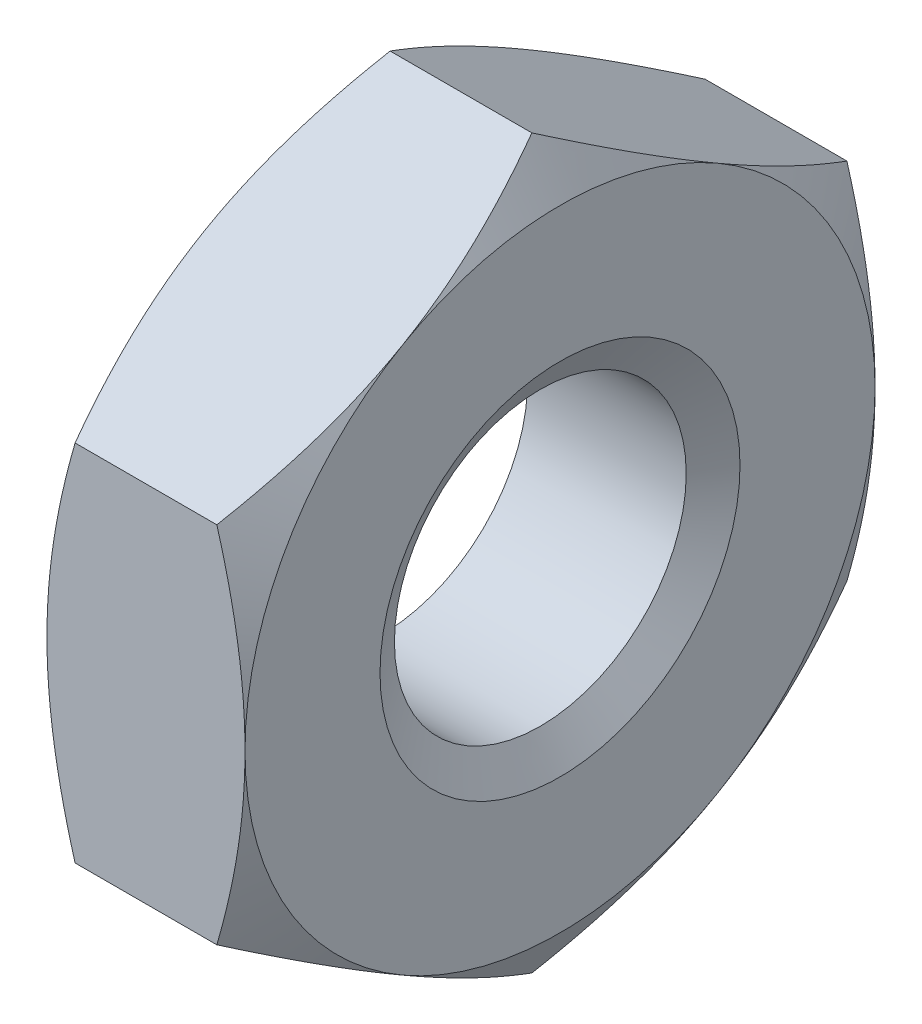
ISO-10303-21;
HEADER;
FILE_DESCRIPTION(('STEP AP214'),'2;1');
FILE_NAME('part.step','',(''),(''),'','','');
FILE_SCHEMA(('AUTOMOTIVE_DESIGN { 1 0 10303 214 1 1 1 1 }'));
ENDSEC;
DATA;
#1=APPLICATION_CONTEXT('core data for automotive mechanical design processes');
#2=APPLICATION_PROTOCOL_DEFINITION('international standard','automotive_design',2000,#1);
#3=PRODUCT_CONTEXT('',#1,'mechanical');
#4=PRODUCT('Part','Part','',(#3));
#5=PRODUCT_RELATED_PRODUCT_CATEGORY('part','',(#4));
#6=PRODUCT_DEFINITION_FORMATION('','',#4);
#7=PRODUCT_DEFINITION_CONTEXT('part definition',#1,'design');
#8=PRODUCT_DEFINITION('design','',#6,#7);
#9=PRODUCT_DEFINITION_SHAPE('','',#8);
#10=(LENGTH_UNIT() NAMED_UNIT(*) SI_UNIT(.MILLI.,.METRE.));
#11=(NAMED_UNIT(*) PLANE_ANGLE_UNIT() SI_UNIT($,.RADIAN.));
#12=(NAMED_UNIT(*) SI_UNIT($,.STERADIAN.) SOLID_ANGLE_UNIT());
#13=UNCERTAINTY_MEASURE_WITH_UNIT(LENGTH_MEASURE(1.E-05),#10,'distance_accuracy_value','');
#14=(GEOMETRIC_REPRESENTATION_CONTEXT(3) GLOBAL_UNCERTAINTY_ASSIGNED_CONTEXT((#13)) GLOBAL_UNIT_ASSIGNED_CONTEXT((#10,
#11,#12)) REPRESENTATION_CONTEXT('',''));
#15=CARTESIAN_POINT('',(0.,0.,0.));
#16=DIRECTION('',(0.,0.,1.));
#17=DIRECTION('',(1.,0.,0.));
#18=AXIS2_PLACEMENT_3D('',#15,#16,#17);
#19=CARTESIAN_POINT('',(0.,-2.02072594216368,-3.5));
#20=DIRECTION('',(0.,-0.866025403784439,-0.5));
#21=DIRECTION('',(0.,0.5,-0.866025403784439));
#22=AXIS2_PLACEMENT_3D('',#19,#20,#21);
#23=PLANE('',#22);
#24=CARTESIAN_POINT('',(0.,-3.03108891324553,-1.75));
#25=CARTESIAN_POINT('',(0.,-2.56217782649107,-2.56217782649107));
#26=CARTESIAN_POINT('',(0.312607391169643,-2.02072594216369,-3.5));
#27=(BOUNDED_CURVE() B_SPLINE_CURVE(2,(#24,#25,#26),.UNSPECIFIED.,.F.,
.F.) B_SPLINE_CURVE_WITH_KNOTS((3,3),(0.204998401571335,0.409996803142671),
.UNSPECIFIED.) CURVE() GEOMETRIC_REPRESENTATION_ITEM() RATIONAL_B_SPLINE_CURVE((1.,
1.03795484930204,1.)) REPRESENTATION_ITEM(''));
#28=CARTESIAN_POINT('',(0.,-3.03108891324553,-1.75));
#29=VERTEX_POINT('',#28);
#30=CARTESIAN_POINT('',(0.312607391169643,-2.02072594216368,-3.5));
#31=VERTEX_POINT('',#30);
#32=EDGE_CURVE('E474',#29,#31,#27,.T.);
#33=ORIENTED_EDGE('',*,*,#32,.T.);
#34=DIRECTION('',(1.,0.,0.));
#35=VECTOR('',#34,1.);
#36=CARTESIAN_POINT('',(0.,-2.02072594216368,-3.5));
#37=LINE('',#36,#35);
#38=CARTESIAN_POINT('',(1.88739260883036,-2.02072594216368,-3.5));
#39=VERTEX_POINT('',#38);
#40=EDGE_CURVE('E11',#31,#39,#37,.T.);
#41=ORIENTED_EDGE('',*,*,#40,.T.);
#42=CARTESIAN_POINT('',(1.88739260883036,-2.02072594216369,-3.5));
#43=CARTESIAN_POINT('',(2.2,-2.56217782649107,-2.56217782649107));
#44=CARTESIAN_POINT('',(2.2,-3.03108891324553,-1.75));
#45=(BOUNDED_CURVE() B_SPLINE_CURVE(2,(#42,#43,#44),.UNSPECIFIED.,.F.,
.F.) B_SPLINE_CURVE_WITH_KNOTS((3,3),(0.,0.204998401571336),
.UNSPECIFIED.) CURVE() GEOMETRIC_REPRESENTATION_ITEM() RATIONAL_B_SPLINE_CURVE((1.,
1.03795484930204,1.)) REPRESENTATION_ITEM(''));
#46=CARTESIAN_POINT('',(2.2,-3.03108891324553,-1.75));
#47=VERTEX_POINT('',#46);
#48=EDGE_CURVE('E203',#39,#47,#45,.T.);
#49=ORIENTED_EDGE('',*,*,#48,.T.);
#50=CARTESIAN_POINT('',(2.2,-3.03108891324553,-1.75));
#51=CARTESIAN_POINT('',(2.2,-3.5,-0.937822173508929));
#52=CARTESIAN_POINT('',(1.88739260883036,-4.04145188432738,0.));
#53=(BOUNDED_CURVE() B_SPLINE_CURVE(2,(#50,#51,#52),.UNSPECIFIED.,.F.,
.F.) B_SPLINE_CURVE_WITH_KNOTS((3,3),(0.204998401571336,0.409996803142671),
.UNSPECIFIED.) CURVE() GEOMETRIC_REPRESENTATION_ITEM() RATIONAL_B_SPLINE_CURVE((1.,
1.03795484930205,1.)) REPRESENTATION_ITEM(''));
#54=CARTESIAN_POINT('',(1.88739260883036,-4.04145188432738,0.));
#55=VERTEX_POINT('',#54);
#56=EDGE_CURVE('E352',#47,#55,#53,.T.);
#57=ORIENTED_EDGE('',*,*,#56,.T.);
#58=DIRECTION('',(1.,0.,0.));
#59=VECTOR('',#58,1.);
#60=CARTESIAN_POINT('',(0.,-4.04145188432738,0.));
#61=LINE('',#60,#59);
#62=CARTESIAN_POINT('',(0.312607391169643,-4.04145188432738,0.));
#63=VERTEX_POINT('',#62);
#64=EDGE_CURVE('E284',#63,#55,#61,.T.);
#65=ORIENTED_EDGE('',*,*,#64,.F.);
#66=CARTESIAN_POINT('',(0.312607391169643,-4.04145188432738,0.));
#67=CARTESIAN_POINT('',(0.,-3.5,-0.937822173508931));
#68=CARTESIAN_POINT('',(0.,-3.03108891324553,-1.75));
#69=(BOUNDED_CURVE() B_SPLINE_CURVE(2,(#66,#67,#68),.UNSPECIFIED.,.F.,
.F.) B_SPLINE_CURVE_WITH_KNOTS((3,3),(0.,0.204998401571335),
.UNSPECIFIED.) CURVE() GEOMETRIC_REPRESENTATION_ITEM() RATIONAL_B_SPLINE_CURVE((1.,
1.03795484930204,1.)) REPRESENTATION_ITEM(''));
#70=EDGE_CURVE('E213',#63,#29,#69,.T.);
#71=ORIENTED_EDGE('',*,*,#70,.T.);
#72=EDGE_LOOP('',(#33,#41,#49,#57,#65,#71));
#73=FACE_BOUND('',#72,.T.);
#74=ADVANCED_FACE('F17',(#73),#23,.T.);
#75=CARTESIAN_POINT('',(0.,2.0207259421637,-3.5));
#76=DIRECTION('',(0.,0.,-1.));
#77=DIRECTION('',(-1.,0.,0.));
#78=AXIS2_PLACEMENT_3D('',#75,#76,#77);
#79=PLANE('',#78);
#80=CARTESIAN_POINT('',(0.,0.,-3.5));
#81=CARTESIAN_POINT('',(0.,0.937822173508934,-3.5));
#82=CARTESIAN_POINT('',(0.312607391169643,2.02072594216369,-3.5));
#83=(BOUNDED_CURVE() B_SPLINE_CURVE(2,(#80,#81,#82),.UNSPECIFIED.,.F.,
.F.) B_SPLINE_CURVE_WITH_KNOTS((3,3),(0.204998401571334,0.409996803142669),
.UNSPECIFIED.) CURVE() GEOMETRIC_REPRESENTATION_ITEM() RATIONAL_B_SPLINE_CURVE((1.,
1.03795484930204,1.)) REPRESENTATION_ITEM(''));
#84=CARTESIAN_POINT('',(0.,0.,-3.5));
#85=VERTEX_POINT('',#84);
#86=CARTESIAN_POINT('',(0.312607391169643,2.0207259421637,-3.5));
#87=VERTEX_POINT('',#86);
#88=EDGE_CURVE('E179',#85,#87,#83,.T.);
#89=ORIENTED_EDGE('',*,*,#88,.T.);
#90=DIRECTION('',(1.,0.,0.));
#91=VECTOR('',#90,1.);
#92=CARTESIAN_POINT('',(0.,2.0207259421637,-3.5));
#93=LINE('',#92,#91);
#94=CARTESIAN_POINT('',(1.88739260883036,2.0207259421637,-3.5));
#95=VERTEX_POINT('',#94);
#96=EDGE_CURVE('E27',#87,#95,#93,.T.);
#97=ORIENTED_EDGE('',*,*,#96,.T.);
#98=CARTESIAN_POINT('',(1.88739260883036,2.02072594216369,-3.5));
#99=CARTESIAN_POINT('',(2.2,0.937822173508933,-3.5));
#100=CARTESIAN_POINT('',(2.2,0.,-3.5));
#101=(BOUNDED_CURVE() B_SPLINE_CURVE(2,(#98,#99,#100),.UNSPECIFIED.,.F.,
.F.) B_SPLINE_CURVE_WITH_KNOTS((3,3),(0.,0.204998401571335),
.UNSPECIFIED.) CURVE() GEOMETRIC_REPRESENTATION_ITEM() RATIONAL_B_SPLINE_CURVE((1.,
1.03795484930204,1.)) REPRESENTATION_ITEM(''));
#102=CARTESIAN_POINT('',(2.2,0.,-3.5));
#103=VERTEX_POINT('',#102);
#104=EDGE_CURVE('E257',#95,#103,#101,.T.);
#105=ORIENTED_EDGE('',*,*,#104,.T.);
#106=CARTESIAN_POINT('',(2.2,0.,-3.5));
#107=CARTESIAN_POINT('',(2.2,-0.93782217350892,-3.50000000000001));
#108=CARTESIAN_POINT('',(1.88739260883036,-2.02072594216368,-3.5));
#109=(BOUNDED_CURVE() B_SPLINE_CURVE(2,(#106,#107,#108),.UNSPECIFIED.,.F.,
.F.) B_SPLINE_CURVE_WITH_KNOTS((3,3),(0.204998401571335,0.409996803142669),
.UNSPECIFIED.) CURVE() GEOMETRIC_REPRESENTATION_ITEM() RATIONAL_B_SPLINE_CURVE((1.,
1.03795484930204,1.)) REPRESENTATION_ITEM(''));
#110=EDGE_CURVE('E247',#103,#39,#109,.T.);
#111=ORIENTED_EDGE('',*,*,#110,.T.);
#112=ORIENTED_EDGE('',*,*,#40,.F.);
#113=CARTESIAN_POINT('',(0.312607391169643,-2.02072594216368,-3.5));
#114=CARTESIAN_POINT('',(0.,-0.937822173508922,-3.50000000000001));
#115=CARTESIAN_POINT('',(0.,0.,-3.5));
#116=(BOUNDED_CURVE() B_SPLINE_CURVE(2,(#113,#114,#115),.UNSPECIFIED.,.F.,
.F.) B_SPLINE_CURVE_WITH_KNOTS((3,3),(0.,0.204998401571334),
.UNSPECIFIED.) CURVE() GEOMETRIC_REPRESENTATION_ITEM() RATIONAL_B_SPLINE_CURVE((1.,
1.03795484930204,1.)) REPRESENTATION_ITEM(''));
#117=EDGE_CURVE('E337',#31,#85,#116,.T.);
#118=ORIENTED_EDGE('',*,*,#117,.T.);
#119=EDGE_LOOP('',(#89,#97,#105,#111,#112,#118));
#120=FACE_BOUND('',#119,.T.);
#121=ADVANCED_FACE('F511',(#120),#79,.T.);
#122=CARTESIAN_POINT('',(0.,4.04145188432738,0.));
#123=DIRECTION('',(0.,0.866025403784439,-0.5));
#124=DIRECTION('',(-1.,0.,0.));
#125=AXIS2_PLACEMENT_3D('',#122,#123,#124);
#126=PLANE('',#125);
#127=CARTESIAN_POINT('',(0.,3.03108891324554,-1.75));
#128=CARTESIAN_POINT('',(0.,3.5,-0.937822173508925));
#129=CARTESIAN_POINT('',(0.312607391169643,4.04145188432738,0.));
#130=(BOUNDED_CURVE() B_SPLINE_CURVE(2,(#127,#128,#129),.UNSPECIFIED.,.F.,
.F.) B_SPLINE_CURVE_WITH_KNOTS((3,3),(0.204998401571335,0.40999680314267),
.UNSPECIFIED.) CURVE() GEOMETRIC_REPRESENTATION_ITEM() RATIONAL_B_SPLINE_CURVE((1.,
1.03795484930204,1.)) REPRESENTATION_ITEM(''));
#131=CARTESIAN_POINT('',(0.,3.03108891324554,-1.75));
#132=VERTEX_POINT('',#131);
#133=CARTESIAN_POINT('',(0.312607391169643,4.04145188432738,0.));
#134=VERTEX_POINT('',#133);
#135=EDGE_CURVE('E173',#132,#134,#130,.T.);
#136=ORIENTED_EDGE('',*,*,#135,.T.);
#137=DIRECTION('',(1.,0.,0.));
#138=VECTOR('',#137,1.);
#139=CARTESIAN_POINT('',(0.,4.04145188432738,0.));
#140=LINE('',#139,#138);
#141=CARTESIAN_POINT('',(1.88739260883036,4.04145188432738,0.));
#142=VERTEX_POINT('',#141);
#143=EDGE_CURVE('E40',#134,#142,#140,.T.);
#144=ORIENTED_EDGE('',*,*,#143,.T.);
#145=CARTESIAN_POINT('',(1.88739260883036,4.04145188432738,0.));
#146=CARTESIAN_POINT('',(2.2,3.5,-0.937822173508927));
#147=CARTESIAN_POINT('',(2.2,3.03108891324554,-1.75));
#148=(BOUNDED_CURVE() B_SPLINE_CURVE(2,(#145,#146,#147),.UNSPECIFIED.,.F.,
.F.) B_SPLINE_CURVE_WITH_KNOTS((3,3),(0.,0.204998401571335),
.UNSPECIFIED.) CURVE() GEOMETRIC_REPRESENTATION_ITEM() RATIONAL_B_SPLINE_CURVE((1.,
1.03795484930204,1.)) REPRESENTATION_ITEM(''));
#149=CARTESIAN_POINT('',(2.2,3.03108891324554,-1.75));
#150=VERTEX_POINT('',#149);
#151=EDGE_CURVE('E161',#142,#150,#148,.T.);
#152=ORIENTED_EDGE('',*,*,#151,.T.);
#153=CARTESIAN_POINT('',(2.2,3.03108891324554,-1.75));
#154=CARTESIAN_POINT('',(2.2,2.56217782649108,-2.56217782649107));
#155=CARTESIAN_POINT('',(1.88739260883036,2.0207259421637,-3.5));
#156=(BOUNDED_CURVE() B_SPLINE_CURVE(2,(#153,#154,#155),.UNSPECIFIED.,.F.,
.F.) B_SPLINE_CURVE_WITH_KNOTS((3,3),(0.204998401571335,0.40999680314267),
.UNSPECIFIED.) CURVE() GEOMETRIC_REPRESENTATION_ITEM() RATIONAL_B_SPLINE_CURVE((1.,
1.03795484930207,1.)) REPRESENTATION_ITEM(''));
#157=EDGE_CURVE('E248',#150,#95,#156,.T.);
#158=ORIENTED_EDGE('',*,*,#157,.T.);
#159=ORIENTED_EDGE('',*,*,#96,.F.);
#160=CARTESIAN_POINT('',(0.312607391169643,2.0207259421637,-3.5));
#161=CARTESIAN_POINT('',(0.,2.56217782649108,-2.56217782649107));
#162=CARTESIAN_POINT('',(0.,3.03108891324554,-1.75));
#163=(BOUNDED_CURVE() B_SPLINE_CURVE(2,(#160,#161,#162),.UNSPECIFIED.,.F.,
.F.) B_SPLINE_CURVE_WITH_KNOTS((3,3),(0.,0.204998401571335),
.UNSPECIFIED.) CURVE() GEOMETRIC_REPRESENTATION_ITEM() RATIONAL_B_SPLINE_CURVE((1.,
1.03795484930205,1.)) REPRESENTATION_ITEM(''));
#164=EDGE_CURVE('E186',#87,#132,#163,.T.);
#165=ORIENTED_EDGE('',*,*,#164,.T.);
#166=EDGE_LOOP('',(#136,#144,#152,#158,#159,#165));
#167=FACE_BOUND('',#166,.T.);
#168=ADVANCED_FACE('F425',(#167),#126,.T.);
#169=CARTESIAN_POINT('',(0.,-4.04145188432738,0.));
#170=DIRECTION('',(0.,-0.866025403784439,0.5));
#171=DIRECTION('',(-1.,0.,0.));
#172=AXIS2_PLACEMENT_3D('',#169,#170,#171);
#173=PLANE('',#172);
#174=CARTESIAN_POINT('',(0.312607391169643,-2.02072594216369,3.5));
#175=CARTESIAN_POINT('',(0.,-2.56217782649107,2.56217782649107));
#176=CARTESIAN_POINT('',(0.,-3.03108891324554,1.75));
#177=(BOUNDED_CURVE() B_SPLINE_CURVE(2,(#174,#175,#176),.UNSPECIFIED.,.F.,
.F.) B_SPLINE_CURVE_WITH_KNOTS((3,3),(0.,0.204998401571335),
.UNSPECIFIED.) CURVE() GEOMETRIC_REPRESENTATION_ITEM() RATIONAL_B_SPLINE_CURVE((1.,
1.03795484930205,1.)) REPRESENTATION_ITEM(''));
#178=CARTESIAN_POINT('',(0.312607391169643,-2.02072594216369,3.5));
#179=VERTEX_POINT('',#178);
#180=CARTESIAN_POINT('',(0.,-3.03108891324554,1.75));
#181=VERTEX_POINT('',#180);
#182=EDGE_CURVE('E234',#179,#181,#177,.T.);
#183=ORIENTED_EDGE('',*,*,#182,.T.);
#184=CARTESIAN_POINT('',(0.,-3.03108891324554,1.75));
#185=CARTESIAN_POINT('',(0.,-3.5,0.937822173508929));
#186=CARTESIAN_POINT('',(0.312607391169643,-4.04145188432738,0.));
#187=(BOUNDED_CURVE() B_SPLINE_CURVE(2,(#184,#185,#186),.UNSPECIFIED.,.F.,
.F.) B_SPLINE_CURVE_WITH_KNOTS((3,3),(0.204998401571335,0.40999680314267),
.UNSPECIFIED.) CURVE() GEOMETRIC_REPRESENTATION_ITEM() RATIONAL_B_SPLINE_CURVE((1.,
1.03795484930205,1.)) REPRESENTATION_ITEM(''));
#188=EDGE_CURVE('E204',#181,#63,#187,.T.);
#189=ORIENTED_EDGE('',*,*,#188,.T.);
#190=ORIENTED_EDGE('',*,*,#64,.T.);
#191=CARTESIAN_POINT('',(1.88739260883036,-4.04145188432738,0.));
#192=CARTESIAN_POINT('',(2.2,-3.5,0.937822173508929));
#193=CARTESIAN_POINT('',(2.2,-3.03108891324554,1.75));
#194=(BOUNDED_CURVE() B_SPLINE_CURVE(2,(#191,#192,#193),.UNSPECIFIED.,.F.,
.F.) B_SPLINE_CURVE_WITH_KNOTS((3,3),(0.,0.204998401571335),
.UNSPECIFIED.) CURVE() GEOMETRIC_REPRESENTATION_ITEM() RATIONAL_B_SPLINE_CURVE((1.,
1.03795484930205,1.)) REPRESENTATION_ITEM(''));
#195=CARTESIAN_POINT('',(2.2,-3.03108891324554,1.75));
#196=VERTEX_POINT('',#195);
#197=EDGE_CURVE('E328',#55,#196,#194,.T.);
#198=ORIENTED_EDGE('',*,*,#197,.T.);
#199=CARTESIAN_POINT('',(2.2,-3.03108891324554,1.75));
#200=CARTESIAN_POINT('',(2.2,-2.56217782649107,2.56217782649107));
#201=CARTESIAN_POINT('',(1.88739260883036,-2.02072594216369,3.5));
#202=(BOUNDED_CURVE() B_SPLINE_CURVE(2,(#199,#200,#201),.UNSPECIFIED.,.F.,
.F.) B_SPLINE_CURVE_WITH_KNOTS((3,3),(0.204998401571335,0.40999680314267),
.UNSPECIFIED.) CURVE() GEOMETRIC_REPRESENTATION_ITEM() RATIONAL_B_SPLINE_CURVE((1.,
1.03795484930203,1.)) REPRESENTATION_ITEM(''));
#203=CARTESIAN_POINT('',(1.88739260883036,-2.02072594216369,3.5));
#204=VERTEX_POINT('',#203);
#205=EDGE_CURVE('E202',#196,#204,#202,.T.);
#206=ORIENTED_EDGE('',*,*,#205,.T.);
#207=DIRECTION('',(1.,0.,0.));
#208=VECTOR('',#207,1.);
#209=CARTESIAN_POINT('',(0.,-2.02072594216369,3.5));
#210=LINE('',#209,#208);
#211=EDGE_CURVE('E263',#179,#204,#210,.T.);
#212=ORIENTED_EDGE('',*,*,#211,.F.);
#213=EDGE_LOOP('',(#183,#189,#190,#198,#206,#212));
#214=FACE_BOUND('',#213,.T.);
#215=ADVANCED_FACE('F408',(#214),#173,.T.);
#216=CARTESIAN_POINT('',(0.,-2.02072594216369,3.5));
#217=DIRECTION('',(0.,0.,1.));
#218=DIRECTION('',(1.,0.,0.));
#219=AXIS2_PLACEMENT_3D('',#216,#217,#218);
#220=PLANE('',#219);
#221=CARTESIAN_POINT('',(0.312607391169643,2.02072594216369,3.5));
#222=CARTESIAN_POINT('',(0.,0.93782217350893,3.5));
#223=CARTESIAN_POINT('',(0.,0.,3.5));
#224=(BOUNDED_CURVE() B_SPLINE_CURVE(2,(#221,#222,#223),.UNSPECIFIED.,.F.,
.F.) B_SPLINE_CURVE_WITH_KNOTS((3,3),(0.,0.204998401571335),
.UNSPECIFIED.) CURVE() GEOMETRIC_REPRESENTATION_ITEM() RATIONAL_B_SPLINE_CURVE((1.,
1.03795484930204,1.)) REPRESENTATION_ITEM(''));
#225=CARTESIAN_POINT('',(0.312607391169643,2.02072594216369,3.5));
#226=VERTEX_POINT('',#225);
#227=CARTESIAN_POINT('',(0.,0.,3.5));
#228=VERTEX_POINT('',#227);
#229=EDGE_CURVE('E152',#226,#228,#224,.T.);
#230=ORIENTED_EDGE('',*,*,#229,.T.);
#231=CARTESIAN_POINT('',(0.,0.,3.5));
#232=CARTESIAN_POINT('',(0.,-0.93782217350893,3.5));
#233=CARTESIAN_POINT('',(0.312607391169643,-2.02072594216369,3.5));
#234=(BOUNDED_CURVE() B_SPLINE_CURVE(2,(#231,#232,#233),.UNSPECIFIED.,.F.,
.F.) B_SPLINE_CURVE_WITH_KNOTS((3,3),(0.204998401571335,0.40999680314267),
.UNSPECIFIED.) CURVE() GEOMETRIC_REPRESENTATION_ITEM() RATIONAL_B_SPLINE_CURVE((1.,
1.03795484930204,1.)) REPRESENTATION_ITEM(''));
#235=EDGE_CURVE('E239',#228,#179,#234,.T.);
#236=ORIENTED_EDGE('',*,*,#235,.T.);
#237=ORIENTED_EDGE('',*,*,#211,.T.);
#238=CARTESIAN_POINT('',(1.88739260883036,-2.02072594216369,3.5));
#239=CARTESIAN_POINT('',(2.2,-0.937822173508928,3.5));
#240=CARTESIAN_POINT('',(2.2,0.,3.5));
#241=(BOUNDED_CURVE() B_SPLINE_CURVE(2,(#238,#239,#240),.UNSPECIFIED.,.F.,
.F.) B_SPLINE_CURVE_WITH_KNOTS((3,3),(0.,0.204998401571335),
.UNSPECIFIED.) CURVE() GEOMETRIC_REPRESENTATION_ITEM() RATIONAL_B_SPLINE_CURVE((1.,
1.03795484930204,1.)) REPRESENTATION_ITEM(''));
#242=CARTESIAN_POINT('',(2.2,0.,3.5));
#243=VERTEX_POINT('',#242);
#244=EDGE_CURVE('E194',#204,#243,#241,.T.);
#245=ORIENTED_EDGE('',*,*,#244,.T.);
#246=CARTESIAN_POINT('',(2.2,0.,3.5));
#247=CARTESIAN_POINT('',(2.2,0.937822173508928,3.5));
#248=CARTESIAN_POINT('',(1.88739260883036,2.02072594216369,3.5));
#249=(BOUNDED_CURVE() B_SPLINE_CURVE(2,(#246,#247,#248),.UNSPECIFIED.,.F.,
.F.) B_SPLINE_CURVE_WITH_KNOTS((3,3),(0.204998401571335,0.40999680314267),
.UNSPECIFIED.) CURVE() GEOMETRIC_REPRESENTATION_ITEM() RATIONAL_B_SPLINE_CURVE((1.,
1.03795484930204,1.)) REPRESENTATION_ITEM(''));
#250=CARTESIAN_POINT('',(1.88739260883036,2.02072594216369,3.5));
#251=VERTEX_POINT('',#250);
#252=EDGE_CURVE('E155',#243,#251,#249,.T.);
#253=ORIENTED_EDGE('',*,*,#252,.T.);
#254=DIRECTION('',(1.,0.,0.));
#255=VECTOR('',#254,1.);
#256=CARTESIAN_POINT('',(0.,2.02072594216369,3.5));
#257=LINE('',#256,#255);
#258=EDGE_CURVE('E148',#226,#251,#257,.T.);
#259=ORIENTED_EDGE('',*,*,#258,.F.);
#260=EDGE_LOOP('',(#230,#236,#237,#245,#253,#259));
#261=FACE_BOUND('',#260,.T.);
#262=ADVANCED_FACE('F150',(#261),#220,.T.);
#263=CARTESIAN_POINT('',(0.,2.02072594216369,3.5));
#264=DIRECTION('',(0.,0.866025403784439,0.5));
#265=DIRECTION('',(1.,0.,0.));
#266=AXIS2_PLACEMENT_3D('',#263,#264,#265);
#267=PLANE('',#266);
#268=CARTESIAN_POINT('',(0.312607391169643,4.04145188432738,0.));
#269=CARTESIAN_POINT('',(0.,3.5,0.937822173508931));
#270=CARTESIAN_POINT('',(0.,3.03108891324554,1.75));
#271=(BOUNDED_CURVE() B_SPLINE_CURVE(2,(#268,#269,#270),.UNSPECIFIED.,.F.,
.F.) B_SPLINE_CURVE_WITH_KNOTS((3,3),(0.,0.204998401571335),
.UNSPECIFIED.) CURVE() GEOMETRIC_REPRESENTATION_ITEM() RATIONAL_B_SPLINE_CURVE((1.,
1.03795484930202,1.)) REPRESENTATION_ITEM(''));
#272=CARTESIAN_POINT('',(0.,3.03108891324554,1.75));
#273=VERTEX_POINT('',#272);
#274=EDGE_CURVE('E177',#134,#273,#271,.T.);
#275=ORIENTED_EDGE('',*,*,#274,.T.);
#276=CARTESIAN_POINT('',(0.,3.03108891324554,1.75));
#277=CARTESIAN_POINT('',(0.,2.56217782649107,2.56217782649107));
#278=CARTESIAN_POINT('',(0.312607391169643,2.02072594216369,3.5));
#279=(BOUNDED_CURVE() B_SPLINE_CURVE(2,(#276,#277,#278),.UNSPECIFIED.,.F.,
.F.) B_SPLINE_CURVE_WITH_KNOTS((3,3),(0.204998401571335,0.40999680314267),
.UNSPECIFIED.) CURVE() GEOMETRIC_REPRESENTATION_ITEM() RATIONAL_B_SPLINE_CURVE((1.,
1.03795484930204,1.)) REPRESENTATION_ITEM(''));
#280=EDGE_CURVE('E167',#273,#226,#279,.T.);
#281=ORIENTED_EDGE('',*,*,#280,.T.);
#282=ORIENTED_EDGE('',*,*,#258,.T.);
#283=CARTESIAN_POINT('',(1.88739260883036,2.02072594216369,3.5));
#284=CARTESIAN_POINT('',(2.2,2.56217782649107,2.56217782649107));
#285=CARTESIAN_POINT('',(2.2,3.03108891324554,1.75));
#286=(BOUNDED_CURVE() B_SPLINE_CURVE(2,(#283,#284,#285),.UNSPECIFIED.,.F.,
.F.) B_SPLINE_CURVE_WITH_KNOTS((3,3),(0.,0.204998401571335),
.UNSPECIFIED.) CURVE() GEOMETRIC_REPRESENTATION_ITEM() RATIONAL_B_SPLINE_CURVE((1.,
1.03795484930203,1.)) REPRESENTATION_ITEM(''));
#287=CARTESIAN_POINT('',(2.2,3.03108891324554,1.75));
#288=VERTEX_POINT('',#287);
#289=EDGE_CURVE('E369',#251,#288,#286,.T.);
#290=ORIENTED_EDGE('',*,*,#289,.T.);
#291=CARTESIAN_POINT('',(2.2,3.03108891324554,1.75));
#292=CARTESIAN_POINT('',(2.2,3.5,0.93782217350893));
#293=CARTESIAN_POINT('',(1.88739260883036,4.04145188432738,0.));
#294=(BOUNDED_CURVE() B_SPLINE_CURVE(2,(#291,#292,#293),.UNSPECIFIED.,.F.,
.F.) B_SPLINE_CURVE_WITH_KNOTS((3,3),(0.204998401571335,0.40999680314267),
.UNSPECIFIED.) CURVE() GEOMETRIC_REPRESENTATION_ITEM() RATIONAL_B_SPLINE_CURVE((1.,
1.03795484930203,1.)) REPRESENTATION_ITEM(''));
#295=EDGE_CURVE('E299',#288,#142,#294,.T.);
#296=ORIENTED_EDGE('',*,*,#295,.T.);
#297=ORIENTED_EDGE('',*,*,#143,.F.);
#298=EDGE_LOOP('',(#275,#281,#282,#290,#296,#297));
#299=FACE_BOUND('',#298,.T.);
#300=ADVANCED_FACE('F175',(#299),#267,.T.);
#301=CARTESIAN_POINT('',(2.04369630441518,0.,0.));
#302=DIRECTION('',(-1.,0.,0.));
#303=DIRECTION('',(0.,1.,0.));
#304=AXIS2_PLACEMENT_3D('',#301,#302,#303);
#305=CONICAL_SURFACE('',#304,3.77072594216369,1.0471975511966);
#306=ORIENTED_EDGE('',*,*,#295,.F.);
#307=CARTESIAN_POINT('',(2.2,0.,0.));
#308=DIRECTION('',(1.,0.,0.));
#309=DIRECTION('',(0.,1.,0.));
#310=AXIS2_PLACEMENT_3D('',#307,#308,#309);
#311=CIRCLE('',#310,3.5);
#312=EDGE_CURVE('E192',#150,#288,#311,.T.);
#313=ORIENTED_EDGE('',*,*,#312,.F.);
#314=ORIENTED_EDGE('',*,*,#151,.F.);
#315=EDGE_LOOP('',(#306,#313,#314));
#316=FACE_BOUND('',#315,.T.);
#317=ADVANCED_FACE('F423',(#316),#305,.T.);
#318=CARTESIAN_POINT('',(2.04369630441518,0.,0.));
#319=DIRECTION('',(-1.,0.,0.));
#320=DIRECTION('',(0.,1.,0.));
#321=AXIS2_PLACEMENT_3D('',#318,#319,#320);
#322=CONICAL_SURFACE('',#321,3.77072594216369,1.0471975511966);
#323=ORIENTED_EDGE('',*,*,#157,.F.);
#324=CARTESIAN_POINT('',(2.2,0.,0.));
#325=DIRECTION('',(1.,0.,0.));
#326=DIRECTION('',(0.,1.,0.));
#327=AXIS2_PLACEMENT_3D('',#324,#325,#326);
#328=CIRCLE('',#327,3.5);
#329=EDGE_CURVE('E233',#103,#150,#328,.T.);
#330=ORIENTED_EDGE('',*,*,#329,.F.);
#331=ORIENTED_EDGE('',*,*,#104,.F.);
#332=EDGE_LOOP('',(#323,#330,#331));
#333=FACE_BOUND('',#332,.T.);
#334=ADVANCED_FACE('F429',(#333),#322,.T.);
#335=CARTESIAN_POINT('',(2.04369630441518,0.,0.));
#336=DIRECTION('',(-1.,0.,0.));
#337=DIRECTION('',(0.,1.,0.));
#338=AXIS2_PLACEMENT_3D('',#335,#336,#337);
#339=CONICAL_SURFACE('',#338,3.77072594216369,1.0471975511966);
#340=ORIENTED_EDGE('',*,*,#289,.F.);
#341=ORIENTED_EDGE('',*,*,#252,.F.);
#342=CARTESIAN_POINT('',(2.2,0.,0.));
#343=DIRECTION('',(1.,0.,0.));
#344=DIRECTION('',(0.,1.,0.));
#345=AXIS2_PLACEMENT_3D('',#342,#343,#344);
#346=CIRCLE('',#345,3.5);
#347=EDGE_CURVE('E295',#288,#243,#346,.T.);
#348=ORIENTED_EDGE('',*,*,#347,.F.);
#349=EDGE_LOOP('',(#340,#341,#348));
#350=FACE_BOUND('',#349,.T.);
#351=ADVANCED_FACE('F421',(#350),#339,.T.);
#352=CARTESIAN_POINT('',(2.04369630441518,0.,0.));
#353=DIRECTION('',(-1.,0.,0.));
#354=DIRECTION('',(0.,1.,0.));
#355=AXIS2_PLACEMENT_3D('',#352,#353,#354);
#356=CONICAL_SURFACE('',#355,3.77072594216369,1.0471975511966);
#357=ORIENTED_EDGE('',*,*,#244,.F.);
#358=ORIENTED_EDGE('',*,*,#205,.F.);
#359=CARTESIAN_POINT('',(2.2,0.,0.));
#360=DIRECTION('',(1.,0.,0.));
#361=DIRECTION('',(0.,1.,0.));
#362=AXIS2_PLACEMENT_3D('',#359,#360,#361);
#363=CIRCLE('',#362,3.5);
#364=EDGE_CURVE('E271',#243,#196,#363,.T.);
#365=ORIENTED_EDGE('',*,*,#364,.F.);
#366=EDGE_LOOP('',(#357,#358,#365));
#367=FACE_BOUND('',#366,.T.);
#368=ADVANCED_FACE('F414',(#367),#356,.T.);
#369=CARTESIAN_POINT('',(2.04369630441518,0.,0.));
#370=DIRECTION('',(-1.,0.,0.));
#371=DIRECTION('',(0.,1.,0.));
#372=AXIS2_PLACEMENT_3D('',#369,#370,#371);
#373=CONICAL_SURFACE('',#372,3.77072594216369,1.0471975511966);
#374=ORIENTED_EDGE('',*,*,#110,.F.);
#375=CARTESIAN_POINT('',(2.2,0.,0.));
#376=DIRECTION('',(1.,0.,0.));
#377=DIRECTION('',(0.,1.,0.));
#378=AXIS2_PLACEMENT_3D('',#375,#376,#377);
#379=CIRCLE('',#378,3.5);
#380=EDGE_CURVE('E225',#47,#103,#379,.T.);
#381=ORIENTED_EDGE('',*,*,#380,.F.);
#382=ORIENTED_EDGE('',*,*,#48,.F.);
#383=EDGE_LOOP('',(#374,#381,#382));
#384=FACE_BOUND('',#383,.T.);
#385=ADVANCED_FACE('F521',(#384),#373,.T.);
#386=CARTESIAN_POINT('',(2.04369630441518,0.,0.));
#387=DIRECTION('',(-1.,0.,0.));
#388=DIRECTION('',(0.,-1.,0.));
#389=AXIS2_PLACEMENT_3D('',#386,#387,#388);
#390=CONICAL_SURFACE('',#389,3.77072594216369,1.0471975511966);
#391=ORIENTED_EDGE('',*,*,#197,.F.);
#392=ORIENTED_EDGE('',*,*,#56,.F.);
#393=CARTESIAN_POINT('',(2.2,0.,0.));
#394=DIRECTION('',(1.,0.,0.));
#395=DIRECTION('',(0.,1.,0.));
#396=AXIS2_PLACEMENT_3D('',#393,#394,#395);
#397=CIRCLE('',#396,3.5);
#398=EDGE_CURVE('E214',#196,#47,#397,.T.);
#399=ORIENTED_EDGE('',*,*,#398,.F.);
#400=EDGE_LOOP('',(#391,#392,#399));
#401=FACE_BOUND('',#400,.T.);
#402=ADVANCED_FACE('F518',(#401),#390,.T.);
#403=CARTESIAN_POINT('',(0.156303695584821,0.,0.));
#404=DIRECTION('',(1.,0.,0.));
#405=DIRECTION('',(0.,1.,0.));
#406=AXIS2_PLACEMENT_3D('',#403,#404,#405);
#407=CONICAL_SURFACE('',#406,3.77072594216369,1.0471975511966);
#408=ORIENTED_EDGE('',*,*,#135,.F.);
#409=CARTESIAN_POINT('',(0.,0.,0.));
#410=DIRECTION('',(-1.,0.,0.));
#411=DIRECTION('',(0.,1.,0.));
#412=AXIS2_PLACEMENT_3D('',#409,#410,#411);
#413=CIRCLE('',#412,3.5);
#414=EDGE_CURVE('E229',#273,#132,#413,.T.);
#415=ORIENTED_EDGE('',*,*,#414,.F.);
#416=ORIENTED_EDGE('',*,*,#274,.F.);
#417=EDGE_LOOP('',(#408,#415,#416));
#418=FACE_BOUND('',#417,.T.);
#419=ADVANCED_FACE('F505',(#418),#407,.T.);
#420=CARTESIAN_POINT('',(0.156303695584821,0.,0.));
#421=DIRECTION('',(1.,0.,0.));
#422=DIRECTION('',(0.,1.,0.));
#423=AXIS2_PLACEMENT_3D('',#420,#421,#422);
#424=CONICAL_SURFACE('',#423,3.77072594216369,1.0471975511966);
#425=ORIENTED_EDGE('',*,*,#280,.F.);
#426=CARTESIAN_POINT('',(0.,0.,0.));
#427=DIRECTION('',(-1.,0.,0.));
#428=DIRECTION('',(0.,1.,0.));
#429=AXIS2_PLACEMENT_3D('',#426,#427,#428);
#430=CIRCLE('',#429,3.5);
#431=EDGE_CURVE('E170',#228,#273,#430,.T.);
#432=ORIENTED_EDGE('',*,*,#431,.F.);
#433=ORIENTED_EDGE('',*,*,#229,.F.);
#434=EDGE_LOOP('',(#425,#432,#433));
#435=FACE_BOUND('',#434,.T.);
#436=ADVANCED_FACE('F166',(#435),#424,.T.);
#437=CARTESIAN_POINT('',(0.156303695584821,0.,0.));
#438=DIRECTION('',(1.,0.,0.));
#439=DIRECTION('',(0.,1.,0.));
#440=AXIS2_PLACEMENT_3D('',#437,#438,#439);
#441=CONICAL_SURFACE('',#440,3.77072594216369,1.0471975511966);
#442=ORIENTED_EDGE('',*,*,#164,.F.);
#443=ORIENTED_EDGE('',*,*,#88,.F.);
#444=CARTESIAN_POINT('',(0.,0.,0.));
#445=DIRECTION('',(-1.,0.,0.));
#446=DIRECTION('',(0.,1.,0.));
#447=AXIS2_PLACEMENT_3D('',#444,#445,#446);
#448=CIRCLE('',#447,3.5);
#449=EDGE_CURVE('E315',#132,#85,#448,.T.);
#450=ORIENTED_EDGE('',*,*,#449,.F.);
#451=EDGE_LOOP('',(#442,#443,#450));
#452=FACE_BOUND('',#451,.T.);
#453=ADVANCED_FACE('F508',(#452),#441,.T.);
#454=CARTESIAN_POINT('',(0.156303695584821,0.,0.));
#455=DIRECTION('',(1.,0.,0.));
#456=DIRECTION('',(0.,1.,0.));
#457=AXIS2_PLACEMENT_3D('',#454,#455,#456);
#458=CONICAL_SURFACE('',#457,3.77072594216369,1.0471975511966);
#459=ORIENTED_EDGE('',*,*,#235,.F.);
#460=CARTESIAN_POINT('',(0.,0.,0.));
#461=DIRECTION('',(-1.,0.,0.));
#462=DIRECTION('',(0.,1.,0.));
#463=AXIS2_PLACEMENT_3D('',#460,#461,#462);
#464=CIRCLE('',#463,3.5);
#465=EDGE_CURVE('E215',#181,#228,#464,.T.);
#466=ORIENTED_EDGE('',*,*,#465,.F.);
#467=ORIENTED_EDGE('',*,*,#182,.F.);
#468=EDGE_LOOP('',(#459,#466,#467));
#469=FACE_BOUND('',#468,.T.);
#470=ADVANCED_FACE('F472',(#469),#458,.T.);
#471=CARTESIAN_POINT('',(0.156303695584821,0.,0.));
#472=DIRECTION('',(1.,0.,0.));
#473=DIRECTION('',(0.,1.,0.));
#474=AXIS2_PLACEMENT_3D('',#471,#472,#473);
#475=CONICAL_SURFACE('',#474,3.77072594216369,1.0471975511966);
#476=ORIENTED_EDGE('',*,*,#117,.F.);
#477=ORIENTED_EDGE('',*,*,#32,.F.);
#478=CARTESIAN_POINT('',(0.,0.,0.));
#479=DIRECTION('',(-1.,0.,0.));
#480=DIRECTION('',(0.,1.,0.));
#481=AXIS2_PLACEMENT_3D('',#478,#479,#480);
#482=CIRCLE('',#481,3.5);
#483=EDGE_CURVE('E275',#85,#29,#482,.T.);
#484=ORIENTED_EDGE('',*,*,#483,.F.);
#485=EDGE_LOOP('',(#476,#477,#484));
#486=FACE_BOUND('',#485,.T.);
#487=ADVANCED_FACE('F19',(#486),#475,.T.);
#488=CARTESIAN_POINT('',(0.156303695584821,0.,0.));
#489=DIRECTION('',(1.,0.,0.));
#490=DIRECTION('',(0.,-1.,0.));
#491=AXIS2_PLACEMENT_3D('',#488,#489,#490);
#492=CONICAL_SURFACE('',#491,3.77072594216369,1.0471975511966);
#493=ORIENTED_EDGE('',*,*,#188,.F.);
#494=CARTESIAN_POINT('',(0.,0.,0.));
#495=DIRECTION('',(-1.,0.,0.));
#496=DIRECTION('',(0.,1.,0.));
#497=AXIS2_PLACEMENT_3D('',#494,#495,#496);
#498=CIRCLE('',#497,3.5);
#499=EDGE_CURVE('E221',#29,#181,#498,.T.);
#500=ORIENTED_EDGE('',*,*,#499,.F.);
#501=ORIENTED_EDGE('',*,*,#70,.F.);
#502=EDGE_LOOP('',(#493,#500,#501));
#503=FACE_BOUND('',#502,.T.);
#504=ADVANCED_FACE('F470',(#503),#492,.T.);
#505=CARTESIAN_POINT('',(2.2,0.,0.));
#506=DIRECTION('',(1.,0.,0.));
#507=DIRECTION('',(0.,1.,0.));
#508=AXIS2_PLACEMENT_3D('',#505,#506,#507);
#509=PLANE('',#508);
#510=CARTESIAN_POINT('',(2.2,0.,0.));
#511=DIRECTION('',(1.,0.,0.));
#512=DIRECTION('',(0.,0.,1.));
#513=AXIS2_PLACEMENT_3D('',#510,#511,#512);
#514=CIRCLE('',#513,1.99988611415569);
#515=CARTESIAN_POINT('',(2.2,0.,-1.99988611415569));
#516=VERTEX_POINT('',#515);
#517=EDGE_CURVE('E226',#516,#516,#514,.T.);
#518=ORIENTED_EDGE('',*,*,#517,.F.);
#519=EDGE_LOOP('',(#518));
#520=FACE_BOUND('',#519,.T.);
#521=ORIENTED_EDGE('',*,*,#380,.T.);
#522=ORIENTED_EDGE('',*,*,#329,.T.);
#523=ORIENTED_EDGE('',*,*,#312,.T.);
#524=ORIENTED_EDGE('',*,*,#347,.T.);
#525=ORIENTED_EDGE('',*,*,#364,.T.);
#526=ORIENTED_EDGE('',*,*,#398,.T.);
#527=EDGE_LOOP('',(#521,#522,#523,#524,#525,#526));
#528=FACE_BOUND('',#527,.T.);
#529=ADVANCED_FACE('F418',(#520,#528),#509,.T.);
#530=CARTESIAN_POINT('',(2.090625,0.,0.));
#531=DIRECTION('',(1.,0.,0.));
#532=DIRECTION('',(0.,0.,1.));
#533=AXIS2_PLACEMENT_3D('',#530,#531,#532);
#534=CONICAL_SURFACE('',#533,1.81044305707785,1.0471975511966);
#535=ORIENTED_EDGE('',*,*,#517,.T.);
#536=DIRECTION('',(-0.5,0.,0.866025403784439));
#537=VECTOR('',#536,1.);
#538=CARTESIAN_POINT('',(2.090625,0.,-1.81044305707785));
#539=LINE('',#538,#537);
#540=CARTESIAN_POINT('',(1.98125,0.,-1.621));
#541=VERTEX_POINT('',#540);
#542=EDGE_CURVE('E222',#516,#541,#539,.T.);
#543=ORIENTED_EDGE('',*,*,#542,.T.);
#544=CARTESIAN_POINT('',(1.98125,0.,0.));
#545=DIRECTION('',(-1.,0.,0.));
#546=DIRECTION('',(0.,0.,1.));
#547=AXIS2_PLACEMENT_3D('',#544,#545,#546);
#548=CIRCLE('',#547,1.621);
#549=CARTESIAN_POINT('',(1.98125,0.,1.621));
#550=VERTEX_POINT('',#549);
#551=EDGE_CURVE('E311',#541,#550,#548,.T.);
#552=ORIENTED_EDGE('',*,*,#551,.T.);
#553=CARTESIAN_POINT('',(1.98125,0.,0.));
#554=DIRECTION('',(-1.,0.,0.));
#555=DIRECTION('',(0.,0.,1.));
#556=AXIS2_PLACEMENT_3D('',#553,#554,#555);
#557=CIRCLE('',#556,1.621);
#558=EDGE_CURVE('E267',#550,#541,#557,.T.);
#559=ORIENTED_EDGE('',*,*,#558,.T.);
#560=ORIENTED_EDGE('',*,*,#542,.F.);
#561=EDGE_LOOP('',(#535,#543,#552,#559,#560));
#562=FACE_BOUND('',#561,.T.);
#563=ADVANCED_FACE('F462',(#562),#534,.F.);
#564=CARTESIAN_POINT('',(0.,0.,0.));
#565=DIRECTION('',(1.,0.,0.));
#566=DIRECTION('',(0.,1.,0.));
#567=AXIS2_PLACEMENT_3D('',#564,#565,#566);
#568=PLANE('',#567);
#569=CARTESIAN_POINT('',(0.,0.,0.));
#570=DIRECTION('',(-1.,0.,0.));
#571=DIRECTION('',(0.,0.,-1.));
#572=AXIS2_PLACEMENT_3D('',#569,#570,#571);
#573=CIRCLE('',#572,1.99988611415569);
#574=CARTESIAN_POINT('',(0.,0.,1.99988611415569));
#575=VERTEX_POINT('',#574);
#576=EDGE_CURVE('E279',#575,#575,#573,.T.);
#577=ORIENTED_EDGE('',*,*,#576,.F.);
#578=EDGE_LOOP('',(#577));
#579=FACE_BOUND('',#578,.T.);
#580=ORIENTED_EDGE('',*,*,#499,.T.);
#581=ORIENTED_EDGE('',*,*,#465,.T.);
#582=ORIENTED_EDGE('',*,*,#431,.T.);
#583=ORIENTED_EDGE('',*,*,#414,.T.);
#584=ORIENTED_EDGE('',*,*,#449,.T.);
#585=ORIENTED_EDGE('',*,*,#483,.T.);
#586=EDGE_LOOP('',(#580,#581,#582,#583,#584,#585));
#587=FACE_BOUND('',#586,.T.);
#588=ADVANCED_FACE('F458',(#579,#587),#568,.F.);
#589=CARTESIAN_POINT('',(-8.71665394401295,0.,0.));
#590=DIRECTION('',(1.,0.,0.));
#591=DIRECTION('',(0.,0.,-1.));
#592=AXIS2_PLACEMENT_3D('',#589,#590,#591);
#593=CYLINDRICAL_SURFACE('',#592,1.621);
#594=ORIENTED_EDGE('',*,*,#551,.F.);
#595=ORIENTED_EDGE('',*,*,#558,.F.);
#596=DIRECTION('',(-1.,0.,0.));
#597=VECTOR('',#596,1.);
#598=CARTESIAN_POINT('',(-8.71665394401295,0.,1.621));
#599=LINE('',#598,#597);
#600=CARTESIAN_POINT('',(0.21875,0.,1.621));
#601=VERTEX_POINT('',#600);
#602=EDGE_CURVE('E264',#550,#601,#599,.T.);
#603=ORIENTED_EDGE('',*,*,#602,.T.);
#604=CARTESIAN_POINT('',(0.21875,0.,0.));
#605=DIRECTION('',(1.,0.,0.));
#606=DIRECTION('',(0.,0.,-1.));
#607=AXIS2_PLACEMENT_3D('',#604,#605,#606);
#608=CIRCLE('',#607,1.621);
#609=EDGE_CURVE('E384',#601,#601,#608,.T.);
#610=ORIENTED_EDGE('',*,*,#609,.F.);
#611=ORIENTED_EDGE('',*,*,#602,.F.);
#612=EDGE_LOOP('',(#594,#595,#603,#610,#611));
#613=FACE_BOUND('',#612,.T.);
#614=ADVANCED_FACE('F461',(#613),#593,.F.);
#615=CARTESIAN_POINT('',(0.109375,0.,0.));
#616=DIRECTION('',(-1.,0.,0.));
#617=DIRECTION('',(0.,0.,-1.));
#618=AXIS2_PLACEMENT_3D('',#615,#616,#617);
#619=CONICAL_SURFACE('',#618,1.81044305707785,1.0471975511966);
#620=ORIENTED_EDGE('',*,*,#576,.T.);
#621=DIRECTION('',(0.5,0.,-0.866025403784439));
#622=VECTOR('',#621,1.);
#623=CARTESIAN_POINT('',(0.109375,0.,1.81044305707785));
#624=LINE('',#623,#622);
#625=EDGE_CURVE('E283',#575,#601,#624,.T.);
#626=ORIENTED_EDGE('',*,*,#625,.T.);
#627=ORIENTED_EDGE('',*,*,#609,.T.);
#628=ORIENTED_EDGE('',*,*,#625,.F.);
#629=EDGE_LOOP('',(#620,#626,#627,#628));
#630=FACE_BOUND('',#629,.T.);
#631=ADVANCED_FACE('F454',(#630),#619,.F.);
#632=CLOSED_SHELL('',(#74,#121,#168,#215,#262,#300,#317,#334,#351,#368,#385,#402,#419,#436,#453,
#470,#487,#504,#529,#563,#588,#614,#631));
#633=MANIFOLD_SOLID_BREP('B1',#632);
#634=ADVANCED_BREP_SHAPE_REPRESENTATION('',(#18,#633),#14);
#635=SHAPE_DEFINITION_REPRESENTATION(#9,#634);
ENDSEC;
END-ISO-10303-21;
